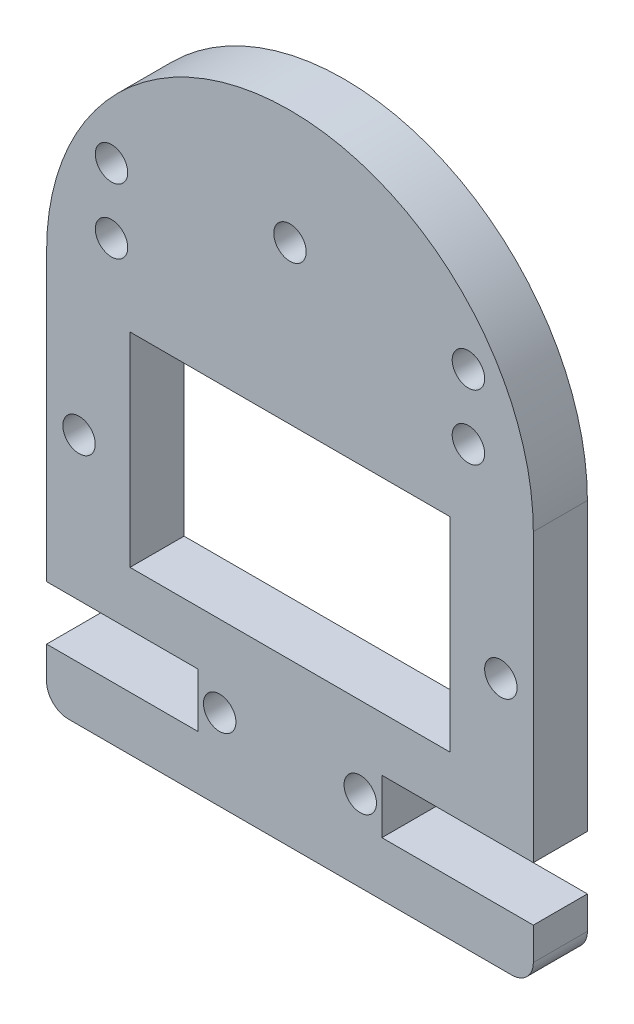
ISO-10303-21;
HEADER;
FILE_DESCRIPTION(('STEP AP214'),'2;1');
FILE_NAME('part.step','',(''),(''),'','','');
FILE_SCHEMA(('AUTOMOTIVE_DESIGN { 1 0 10303 214 1 1 1 1 }'));
ENDSEC;
DATA;
#1=APPLICATION_CONTEXT('core data for automotive mechanical design processes');
#2=APPLICATION_PROTOCOL_DEFINITION('international standard','automotive_design',2000,#1);
#3=PRODUCT_CONTEXT('',#1,'mechanical');
#4=PRODUCT('Part','Part','',(#3));
#5=PRODUCT_RELATED_PRODUCT_CATEGORY('part','',(#4));
#6=PRODUCT_DEFINITION_FORMATION('','',#4);
#7=PRODUCT_DEFINITION_CONTEXT('part definition',#1,'design');
#8=PRODUCT_DEFINITION('design','',#6,#7);
#9=PRODUCT_DEFINITION_SHAPE('','',#8);
#10=(LENGTH_UNIT() NAMED_UNIT(*) SI_UNIT(.MILLI.,.METRE.));
#11=(NAMED_UNIT(*) PLANE_ANGLE_UNIT() SI_UNIT($,.RADIAN.));
#12=(NAMED_UNIT(*) SI_UNIT($,.STERADIAN.) SOLID_ANGLE_UNIT());
#13=UNCERTAINTY_MEASURE_WITH_UNIT(LENGTH_MEASURE(1.E-05),#10,'distance_accuracy_value','');
#14=(GEOMETRIC_REPRESENTATION_CONTEXT(3) GLOBAL_UNCERTAINTY_ASSIGNED_CONTEXT((#13)) GLOBAL_UNIT_ASSIGNED_CONTEXT((#10,
#11,#12)) REPRESENTATION_CONTEXT('',''));
#15=CARTESIAN_POINT('',(0.,0.,0.));
#16=DIRECTION('',(0.,0.,1.));
#17=DIRECTION('',(1.,0.,0.));
#18=AXIS2_PLACEMENT_3D('',#15,#16,#17);
#19=CARTESIAN_POINT('',(-1.76634170575383,13.25,5.));
#20=DIRECTION('',(0.,0.,-1.));
#21=DIRECTION('',(-1.,0.,0.));
#22=AXIS2_PLACEMENT_3D('',#19,#20,#21);
#23=CYLINDRICAL_SURFACE('',#22,22.5);
#24=CARTESIAN_POINT('',(-1.76634170575383,13.25,0.));
#25=DIRECTION('',(0.,0.,1.));
#26=DIRECTION('',(1.,0.,0.));
#27=AXIS2_PLACEMENT_3D('',#24,#25,#26);
#28=CIRCLE('',#27,22.5);
#29=CARTESIAN_POINT('',(20.7336582942462,13.25,0.));
#30=VERTEX_POINT('',#29);
#31=CARTESIAN_POINT('',(-24.2663417057538,13.25,0.));
#32=VERTEX_POINT('',#31);
#33=EDGE_CURVE('E196',#30,#32,#28,.T.);
#34=ORIENTED_EDGE('',*,*,#33,.T.);
#35=DIRECTION('',(0.,0.,-1.));
#36=VECTOR('',#35,1.);
#37=CARTESIAN_POINT('',(-24.2663417057538,13.25,5.));
#38=LINE('',#37,#36);
#39=CARTESIAN_POINT('',(-24.2663417057538,13.25,5.));
#40=VERTEX_POINT('',#39);
#41=EDGE_CURVE('E11',#40,#32,#38,.T.);
#42=ORIENTED_EDGE('',*,*,#41,.F.);
#43=CARTESIAN_POINT('',(-1.76634170575383,13.25,5.));
#44=DIRECTION('',(0.,0.,1.));
#45=DIRECTION('',(1.,0.,0.));
#46=AXIS2_PLACEMENT_3D('',#43,#44,#45);
#47=CIRCLE('',#46,22.5);
#48=CARTESIAN_POINT('',(20.7336582942462,13.25,5.));
#49=VERTEX_POINT('',#48);
#50=EDGE_CURVE('E200',#49,#40,#47,.T.);
#51=ORIENTED_EDGE('',*,*,#50,.F.);
#52=DIRECTION('',(0.,0.,-1.));
#53=VECTOR('',#52,1.);
#54=CARTESIAN_POINT('',(20.7336582942462,13.25,5.));
#55=LINE('',#54,#53);
#56=EDGE_CURVE('E230',#49,#30,#55,.T.);
#57=ORIENTED_EDGE('',*,*,#56,.T.);
#58=EDGE_LOOP('',(#34,#42,#51,#57));
#59=FACE_BOUND('',#58,.T.);
#60=ADVANCED_FACE('F33',(#59),#23,.T.);
#61=CARTESIAN_POINT('',(-24.2663417057538,-13.25,5.));
#62=DIRECTION('',(1.,0.,0.));
#63=DIRECTION('',(0.,0.,-1.));
#64=AXIS2_PLACEMENT_3D('',#61,#62,#63);
#65=PLANE('',#64);
#66=DIRECTION('',(0.,-1.,0.));
#67=VECTOR('',#66,1.);
#68=CARTESIAN_POINT('',(-24.2663417057538,-13.25,0.));
#69=LINE('',#68,#67);
#70=CARTESIAN_POINT('',(-24.2663417057538,-13.25,0.));
#71=VERTEX_POINT('',#70);
#72=EDGE_CURVE('E233',#32,#71,#69,.T.);
#73=ORIENTED_EDGE('',*,*,#72,.T.);
#74=DIRECTION('',(0.,0.,-1.));
#75=VECTOR('',#74,1.);
#76=CARTESIAN_POINT('',(-24.2663417057538,-13.25,5.));
#77=LINE('',#76,#75);
#78=CARTESIAN_POINT('',(-24.2663417057538,-13.25,5.));
#79=VERTEX_POINT('',#78);
#80=EDGE_CURVE('E41',#79,#71,#77,.T.);
#81=ORIENTED_EDGE('',*,*,#80,.F.);
#82=DIRECTION('',(0.,-1.,0.));
#83=VECTOR('',#82,1.);
#84=CARTESIAN_POINT('',(-24.2663417057538,-3.25,5.));
#85=LINE('',#84,#83);
#86=EDGE_CURVE('E203',#40,#79,#85,.T.);
#87=ORIENTED_EDGE('',*,*,#86,.F.);
#88=ORIENTED_EDGE('',*,*,#41,.T.);
#89=EDGE_LOOP('',(#73,#81,#87,#88));
#90=FACE_BOUND('',#89,.T.);
#91=ADVANCED_FACE('F420',(#90),#65,.F.);
#92=CARTESIAN_POINT('',(-10.2663417057538,-13.25,5.));
#93=DIRECTION('',(0.,1.,0.));
#94=DIRECTION('',(0.,0.,1.));
#95=AXIS2_PLACEMENT_3D('',#92,#93,#94);
#96=PLANE('',#95);
#97=DIRECTION('',(1.,0.,0.));
#98=VECTOR('',#97,1.);
#99=CARTESIAN_POINT('',(-10.2663417057538,-13.25,0.));
#100=LINE('',#99,#98);
#101=CARTESIAN_POINT('',(-10.2663417057538,-13.25,0.));
#102=VERTEX_POINT('',#101);
#103=EDGE_CURVE('E235',#71,#102,#100,.T.);
#104=ORIENTED_EDGE('',*,*,#103,.T.);
#105=DIRECTION('',(0.,0.,-1.));
#106=VECTOR('',#105,1.);
#107=CARTESIAN_POINT('',(-10.2663417057538,-13.25,5.));
#108=LINE('',#107,#106);
#109=CARTESIAN_POINT('',(-10.2663417057538,-13.25,5.));
#110=VERTEX_POINT('',#109);
#111=EDGE_CURVE('E291',#110,#102,#108,.T.);
#112=ORIENTED_EDGE('',*,*,#111,.F.);
#113=DIRECTION('',(1.,0.,0.));
#114=VECTOR('',#113,1.);
#115=CARTESIAN_POINT('',(-10.2663417057538,-13.25,5.));
#116=LINE('',#115,#114);
#117=EDGE_CURVE('E206',#79,#110,#116,.T.);
#118=ORIENTED_EDGE('',*,*,#117,.F.);
#119=ORIENTED_EDGE('',*,*,#80,.T.);
#120=EDGE_LOOP('',(#104,#112,#118,#119));
#121=FACE_BOUND('',#120,.T.);
#122=ADVANCED_FACE('F416',(#121),#96,.F.);
#123=CARTESIAN_POINT('',(-10.2663417057538,-13.25,5.));
#124=DIRECTION('',(1.,0.,0.));
#125=DIRECTION('',(0.,1.,0.));
#126=AXIS2_PLACEMENT_3D('',#123,#124,#125);
#127=PLANE('',#126);
#128=DIRECTION('',(0.,-1.,0.));
#129=VECTOR('',#128,1.);
#130=CARTESIAN_POINT('',(-10.2663417057538,-13.25,0.));
#131=LINE('',#130,#129);
#132=CARTESIAN_POINT('',(-10.2663417057538,-18.25,0.));
#133=VERTEX_POINT('',#132);
#134=EDGE_CURVE('E237',#102,#133,#131,.T.);
#135=ORIENTED_EDGE('',*,*,#134,.T.);
#136=DIRECTION('',(0.,0.,-1.));
#137=VECTOR('',#136,1.);
#138=CARTESIAN_POINT('',(-10.2663417057538,-18.25,5.));
#139=LINE('',#138,#137);
#140=CARTESIAN_POINT('',(-10.2663417057538,-18.25,5.));
#141=VERTEX_POINT('',#140);
#142=EDGE_CURVE('E288',#141,#133,#139,.T.);
#143=ORIENTED_EDGE('',*,*,#142,.F.);
#144=DIRECTION('',(0.,-1.,0.));
#145=VECTOR('',#144,1.);
#146=CARTESIAN_POINT('',(-10.2663417057538,-13.25,5.));
#147=LINE('',#146,#145);
#148=EDGE_CURVE('E208',#110,#141,#147,.T.);
#149=ORIENTED_EDGE('',*,*,#148,.F.);
#150=ORIENTED_EDGE('',*,*,#111,.T.);
#151=EDGE_LOOP('',(#135,#143,#149,#150));
#152=FACE_BOUND('',#151,.T.);
#153=ADVANCED_FACE('F413',(#152),#127,.F.);
#154=CARTESIAN_POINT('',(-10.2663417057538,-18.25,5.));
#155=DIRECTION('',(0.,-1.,0.));
#156=DIRECTION('',(0.,0.,-1.));
#157=AXIS2_PLACEMENT_3D('',#154,#155,#156);
#158=PLANE('',#157);
#159=DIRECTION('',(-1.,0.,0.));
#160=VECTOR('',#159,1.);
#161=CARTESIAN_POINT('',(-10.2663417057538,-18.25,0.));
#162=LINE('',#161,#160);
#163=CARTESIAN_POINT('',(-24.2663417057538,-18.25,0.));
#164=VERTEX_POINT('',#163);
#165=EDGE_CURVE('E239',#133,#164,#162,.T.);
#166=ORIENTED_EDGE('',*,*,#165,.T.);
#167=DIRECTION('',(0.,0.,-1.));
#168=VECTOR('',#167,1.);
#169=CARTESIAN_POINT('',(-24.2663417057538,-18.25,5.));
#170=LINE('',#169,#168);
#171=CARTESIAN_POINT('',(-24.2663417057538,-18.25,5.));
#172=VERTEX_POINT('',#171);
#173=EDGE_CURVE('E285',#172,#164,#170,.T.);
#174=ORIENTED_EDGE('',*,*,#173,.F.);
#175=DIRECTION('',(-1.,0.,0.));
#176=VECTOR('',#175,1.);
#177=CARTESIAN_POINT('',(-10.2663417057538,-18.25,5.));
#178=LINE('',#177,#176);
#179=EDGE_CURVE('E210',#141,#172,#178,.T.);
#180=ORIENTED_EDGE('',*,*,#179,.F.);
#181=ORIENTED_EDGE('',*,*,#142,.T.);
#182=EDGE_LOOP('',(#166,#174,#180,#181));
#183=FACE_BOUND('',#182,.T.);
#184=ADVANCED_FACE('F409',(#183),#158,.F.);
#185=CARTESIAN_POINT('',(-24.2663417057538,-18.25,5.));
#186=DIRECTION('',(1.,0.,0.));
#187=DIRECTION('',(0.,0.,-1.));
#188=AXIS2_PLACEMENT_3D('',#185,#186,#187);
#189=PLANE('',#188);
#190=DIRECTION('',(0.,-1.,0.));
#191=VECTOR('',#190,1.);
#192=CARTESIAN_POINT('',(-24.2663417057538,-18.25,0.));
#193=LINE('',#192,#191);
#194=CARTESIAN_POINT('',(-24.2663417057538,-21.25,0.));
#195=VERTEX_POINT('',#194);
#196=EDGE_CURVE('E241',#164,#195,#193,.T.);
#197=ORIENTED_EDGE('',*,*,#196,.T.);
#198=DIRECTION('',(0.,0.,-1.));
#199=VECTOR('',#198,1.);
#200=CARTESIAN_POINT('',(-24.2663417057538,-21.25,5.));
#201=LINE('',#200,#199);
#202=CARTESIAN_POINT('',(-24.2663417057538,-21.25,5.));
#203=VERTEX_POINT('',#202);
#204=EDGE_CURVE('E282',#203,#195,#201,.T.);
#205=ORIENTED_EDGE('',*,*,#204,.F.);
#206=DIRECTION('',(0.,-1.,0.));
#207=VECTOR('',#206,1.);
#208=CARTESIAN_POINT('',(-24.2663417057538,-18.25,5.));
#209=LINE('',#208,#207);
#210=EDGE_CURVE('E212',#172,#203,#209,.T.);
#211=ORIENTED_EDGE('',*,*,#210,.F.);
#212=ORIENTED_EDGE('',*,*,#173,.T.);
#213=EDGE_LOOP('',(#197,#205,#211,#212));
#214=FACE_BOUND('',#213,.T.);
#215=ADVANCED_FACE('F404',(#214),#189,.F.);
#216=CARTESIAN_POINT('',(-22.2663417057538,-21.25,5.));
#217=DIRECTION('',(0.,0.,-1.));
#218=DIRECTION('',(-1.,0.,0.));
#219=AXIS2_PLACEMENT_3D('',#216,#217,#218);
#220=CYLINDRICAL_SURFACE('',#219,2.);
#221=CARTESIAN_POINT('',(-22.2663417057538,-21.25,0.));
#222=DIRECTION('',(0.,0.,1.));
#223=DIRECTION('',(1.,0.,0.));
#224=AXIS2_PLACEMENT_3D('',#221,#222,#223);
#225=CIRCLE('',#224,2.);
#226=CARTESIAN_POINT('',(-22.2663417057538,-23.25,0.));
#227=VERTEX_POINT('',#226);
#228=EDGE_CURVE('E243',#195,#227,#225,.T.);
#229=ORIENTED_EDGE('',*,*,#228,.T.);
#230=DIRECTION('',(0.,0.,-1.));
#231=VECTOR('',#230,1.);
#232=CARTESIAN_POINT('',(-22.2663417057538,-23.25,5.));
#233=LINE('',#232,#231);
#234=CARTESIAN_POINT('',(-22.2663417057538,-23.25,5.));
#235=VERTEX_POINT('',#234);
#236=EDGE_CURVE('E279',#235,#227,#233,.T.);
#237=ORIENTED_EDGE('',*,*,#236,.F.);
#238=CARTESIAN_POINT('',(-22.2663417057538,-21.25,5.));
#239=DIRECTION('',(0.,0.,1.));
#240=DIRECTION('',(1.,0.,0.));
#241=AXIS2_PLACEMENT_3D('',#238,#239,#240);
#242=CIRCLE('',#241,2.);
#243=EDGE_CURVE('E214',#203,#235,#242,.T.);
#244=ORIENTED_EDGE('',*,*,#243,.F.);
#245=ORIENTED_EDGE('',*,*,#204,.T.);
#246=EDGE_LOOP('',(#229,#237,#244,#245));
#247=FACE_BOUND('',#246,.T.);
#248=ADVANCED_FACE('F398',(#247),#220,.T.);
#249=CARTESIAN_POINT('',(18.7336582942462,-23.25,5.));
#250=DIRECTION('',(0.,1.,0.));
#251=DIRECTION('',(0.,0.,1.));
#252=AXIS2_PLACEMENT_3D('',#249,#250,#251);
#253=PLANE('',#252);
#254=DIRECTION('',(1.,0.,0.));
#255=VECTOR('',#254,1.);
#256=CARTESIAN_POINT('',(18.7336582942462,-23.25,0.));
#257=LINE('',#256,#255);
#258=CARTESIAN_POINT('',(18.7336582942462,-23.25,0.));
#259=VERTEX_POINT('',#258);
#260=EDGE_CURVE('E245',#227,#259,#257,.T.);
#261=ORIENTED_EDGE('',*,*,#260,.T.);
#262=DIRECTION('',(0.,0.,-1.));
#263=VECTOR('',#262,1.);
#264=CARTESIAN_POINT('',(18.7336582942462,-23.25,5.));
#265=LINE('',#264,#263);
#266=CARTESIAN_POINT('',(18.7336582942462,-23.25,5.));
#267=VERTEX_POINT('',#266);
#268=EDGE_CURVE('E276',#267,#259,#265,.T.);
#269=ORIENTED_EDGE('',*,*,#268,.F.);
#270=DIRECTION('',(1.,0.,0.));
#271=VECTOR('',#270,1.);
#272=CARTESIAN_POINT('',(18.7336582942462,-23.25,5.));
#273=LINE('',#272,#271);
#274=EDGE_CURVE('E216',#235,#267,#273,.T.);
#275=ORIENTED_EDGE('',*,*,#274,.F.);
#276=ORIENTED_EDGE('',*,*,#236,.T.);
#277=EDGE_LOOP('',(#261,#269,#275,#276));
#278=FACE_BOUND('',#277,.T.);
#279=ADVANCED_FACE('F394',(#278),#253,.F.);
#280=CARTESIAN_POINT('',(18.7336582942462,-21.25,5.));
#281=DIRECTION('',(0.,0.,-1.));
#282=DIRECTION('',(-1.,0.,0.));
#283=AXIS2_PLACEMENT_3D('',#280,#281,#282);
#284=CYLINDRICAL_SURFACE('',#283,2.);
#285=CARTESIAN_POINT('',(18.7336582942462,-21.25,0.));
#286=DIRECTION('',(0.,0.,1.));
#287=DIRECTION('',(1.,0.,0.));
#288=AXIS2_PLACEMENT_3D('',#285,#286,#287);
#289=CIRCLE('',#288,2.);
#290=CARTESIAN_POINT('',(20.7336582942462,-21.25,0.));
#291=VERTEX_POINT('',#290);
#292=EDGE_CURVE('E247',#259,#291,#289,.T.);
#293=ORIENTED_EDGE('',*,*,#292,.T.);
#294=DIRECTION('',(0.,0.,-1.));
#295=VECTOR('',#294,1.);
#296=CARTESIAN_POINT('',(20.7336582942462,-21.25,5.));
#297=LINE('',#296,#295);
#298=CARTESIAN_POINT('',(20.7336582942462,-21.25,5.));
#299=VERTEX_POINT('',#298);
#300=EDGE_CURVE('E273',#299,#291,#297,.T.);
#301=ORIENTED_EDGE('',*,*,#300,.F.);
#302=CARTESIAN_POINT('',(18.7336582942462,-21.25,5.));
#303=DIRECTION('',(0.,0.,1.));
#304=DIRECTION('',(1.,0.,0.));
#305=AXIS2_PLACEMENT_3D('',#302,#303,#304);
#306=CIRCLE('',#305,2.);
#307=EDGE_CURVE('E218',#267,#299,#306,.T.);
#308=ORIENTED_EDGE('',*,*,#307,.F.);
#309=ORIENTED_EDGE('',*,*,#268,.T.);
#310=EDGE_LOOP('',(#293,#301,#308,#309));
#311=FACE_BOUND('',#310,.T.);
#312=ADVANCED_FACE('F389',(#311),#284,.T.);
#313=CARTESIAN_POINT('',(20.7336582942462,-18.25,5.));
#314=DIRECTION('',(-1.,0.,0.));
#315=DIRECTION('',(0.,0.,1.));
#316=AXIS2_PLACEMENT_3D('',#313,#314,#315);
#317=PLANE('',#316);
#318=DIRECTION('',(0.,1.,0.));
#319=VECTOR('',#318,1.);
#320=CARTESIAN_POINT('',(20.7336582942462,-18.25,0.));
#321=LINE('',#320,#319);
#322=CARTESIAN_POINT('',(20.7336582942462,-18.25,0.));
#323=VERTEX_POINT('',#322);
#324=EDGE_CURVE('E249',#291,#323,#321,.T.);
#325=ORIENTED_EDGE('',*,*,#324,.T.);
#326=DIRECTION('',(0.,0.,-1.));
#327=VECTOR('',#326,1.);
#328=CARTESIAN_POINT('',(20.7336582942462,-18.25,5.));
#329=LINE('',#328,#327);
#330=CARTESIAN_POINT('',(20.7336582942462,-18.25,5.));
#331=VERTEX_POINT('',#330);
#332=EDGE_CURVE('E270',#331,#323,#329,.T.);
#333=ORIENTED_EDGE('',*,*,#332,.F.);
#334=DIRECTION('',(0.,1.,0.));
#335=VECTOR('',#334,1.);
#336=CARTESIAN_POINT('',(20.7336582942462,-18.25,5.));
#337=LINE('',#336,#335);
#338=EDGE_CURVE('E220',#299,#331,#337,.T.);
#339=ORIENTED_EDGE('',*,*,#338,.F.);
#340=ORIENTED_EDGE('',*,*,#300,.T.);
#341=EDGE_LOOP('',(#325,#333,#339,#340));
#342=FACE_BOUND('',#341,.T.);
#343=ADVANCED_FACE('F383',(#342),#317,.F.);
#344=CARTESIAN_POINT('',(6.73365829424617,-18.25,5.));
#345=DIRECTION('',(0.,-1.,0.));
#346=DIRECTION('',(0.,0.,-1.));
#347=AXIS2_PLACEMENT_3D('',#344,#345,#346);
#348=PLANE('',#347);
#349=DIRECTION('',(-1.,0.,0.));
#350=VECTOR('',#349,1.);
#351=CARTESIAN_POINT('',(6.73365829424617,-18.25,0.));
#352=LINE('',#351,#350);
#353=CARTESIAN_POINT('',(6.73365829424617,-18.25,0.));
#354=VERTEX_POINT('',#353);
#355=EDGE_CURVE('E251',#323,#354,#352,.T.);
#356=ORIENTED_EDGE('',*,*,#355,.T.);
#357=DIRECTION('',(0.,0.,-1.));
#358=VECTOR('',#357,1.);
#359=CARTESIAN_POINT('',(6.73365829424617,-18.25,5.));
#360=LINE('',#359,#358);
#361=CARTESIAN_POINT('',(6.73365829424617,-18.25,5.));
#362=VERTEX_POINT('',#361);
#363=EDGE_CURVE('E267',#362,#354,#360,.T.);
#364=ORIENTED_EDGE('',*,*,#363,.F.);
#365=DIRECTION('',(-1.,0.,0.));
#366=VECTOR('',#365,1.);
#367=CARTESIAN_POINT('',(6.73365829424617,-18.25,5.));
#368=LINE('',#367,#366);
#369=EDGE_CURVE('E222',#331,#362,#368,.T.);
#370=ORIENTED_EDGE('',*,*,#369,.F.);
#371=ORIENTED_EDGE('',*,*,#332,.T.);
#372=EDGE_LOOP('',(#356,#364,#370,#371));
#373=FACE_BOUND('',#372,.T.);
#374=ADVANCED_FACE('F379',(#373),#348,.F.);
#375=CARTESIAN_POINT('',(6.73365829424617,-13.25,5.));
#376=DIRECTION('',(-1.,0.,0.));
#377=DIRECTION('',(0.,0.,1.));
#378=AXIS2_PLACEMENT_3D('',#375,#376,#377);
#379=PLANE('',#378);
#380=DIRECTION('',(0.,1.,0.));
#381=VECTOR('',#380,1.);
#382=CARTESIAN_POINT('',(6.73365829424617,-13.25,0.));
#383=LINE('',#382,#381);
#384=CARTESIAN_POINT('',(6.73365829424617,-13.25,0.));
#385=VERTEX_POINT('',#384);
#386=EDGE_CURVE('E253',#354,#385,#383,.T.);
#387=ORIENTED_EDGE('',*,*,#386,.T.);
#388=DIRECTION('',(0.,0.,-1.));
#389=VECTOR('',#388,1.);
#390=CARTESIAN_POINT('',(6.73365829424617,-13.25,5.));
#391=LINE('',#390,#389);
#392=CARTESIAN_POINT('',(6.73365829424617,-13.25,5.));
#393=VERTEX_POINT('',#392);
#394=EDGE_CURVE('E264',#393,#385,#391,.T.);
#395=ORIENTED_EDGE('',*,*,#394,.F.);
#396=DIRECTION('',(0.,1.,0.));
#397=VECTOR('',#396,1.);
#398=CARTESIAN_POINT('',(6.73365829424617,-13.25,5.));
#399=LINE('',#398,#397);
#400=EDGE_CURVE('E224',#362,#393,#399,.T.);
#401=ORIENTED_EDGE('',*,*,#400,.F.);
#402=ORIENTED_EDGE('',*,*,#363,.T.);
#403=EDGE_LOOP('',(#387,#395,#401,#402));
#404=FACE_BOUND('',#403,.T.);
#405=ADVANCED_FACE('F374',(#404),#379,.F.);
#406=CARTESIAN_POINT('',(6.73365829424617,-13.25,5.));
#407=DIRECTION('',(0.,1.,0.));
#408=DIRECTION('',(0.,0.,1.));
#409=AXIS2_PLACEMENT_3D('',#406,#407,#408);
#410=PLANE('',#409);
#411=DIRECTION('',(1.,0.,0.));
#412=VECTOR('',#411,1.);
#413=CARTESIAN_POINT('',(6.73365829424617,-13.25,0.));
#414=LINE('',#413,#412);
#415=CARTESIAN_POINT('',(20.7336582942462,-13.25,0.));
#416=VERTEX_POINT('',#415);
#417=EDGE_CURVE('E255',#385,#416,#414,.T.);
#418=ORIENTED_EDGE('',*,*,#417,.T.);
#419=DIRECTION('',(0.,0.,-1.));
#420=VECTOR('',#419,1.);
#421=CARTESIAN_POINT('',(20.7336582942462,-13.25,5.));
#422=LINE('',#421,#420);
#423=CARTESIAN_POINT('',(20.7336582942462,-13.25,5.));
#424=VERTEX_POINT('',#423);
#425=EDGE_CURVE('E261',#424,#416,#422,.T.);
#426=ORIENTED_EDGE('',*,*,#425,.F.);
#427=DIRECTION('',(1.,0.,0.));
#428=VECTOR('',#427,1.);
#429=CARTESIAN_POINT('',(6.73365829424617,-13.25,5.));
#430=LINE('',#429,#428);
#431=EDGE_CURVE('E226',#393,#424,#430,.T.);
#432=ORIENTED_EDGE('',*,*,#431,.F.);
#433=ORIENTED_EDGE('',*,*,#394,.T.);
#434=EDGE_LOOP('',(#418,#426,#432,#433));
#435=FACE_BOUND('',#434,.T.);
#436=ADVANCED_FACE('F368',(#435),#410,.F.);
#437=CARTESIAN_POINT('',(20.7336582942462,-3.22226862184038,5.));
#438=DIRECTION('',(-1.,0.,0.));
#439=DIRECTION('',(0.,0.,1.));
#440=AXIS2_PLACEMENT_3D('',#437,#438,#439);
#441=PLANE('',#440);
#442=DIRECTION('',(0.,1.,0.));
#443=VECTOR('',#442,1.);
#444=CARTESIAN_POINT('',(20.7336582942462,-3.22226862184038,0.));
#445=LINE('',#444,#443);
#446=EDGE_CURVE('E204',#416,#30,#445,.T.);
#447=ORIENTED_EDGE('',*,*,#446,.T.);
#448=ORIENTED_EDGE('',*,*,#56,.F.);
#449=DIRECTION('',(0.,1.,0.));
#450=VECTOR('',#449,1.);
#451=CARTESIAN_POINT('',(20.7336582942462,-13.25,5.));
#452=LINE('',#451,#450);
#453=EDGE_CURVE('E228',#424,#49,#452,.T.);
#454=ORIENTED_EDGE('',*,*,#453,.F.);
#455=ORIENTED_EDGE('',*,*,#425,.T.);
#456=EDGE_LOOP('',(#447,#448,#454,#455));
#457=FACE_BOUND('',#456,.T.);
#458=ADVANCED_FACE('F364',(#457),#441,.F.);
#459=CARTESIAN_POINT('',(-1.76634170575383,13.25,5.));
#460=DIRECTION('',(0.,0.,1.));
#461=DIRECTION('',(1.,0.,0.));
#462=AXIS2_PLACEMENT_3D('',#459,#460,#461);
#463=PLANE('',#462);
#464=CARTESIAN_POINT('',(14.7336582942462,23.25,5.));
#465=DIRECTION('',(0.,0.,1.));
#466=DIRECTION('',(1.,0.,0.));
#467=AXIS2_PLACEMENT_3D('',#464,#465,#466);
#468=CIRCLE('',#467,1.5);
#469=CARTESIAN_POINT('',(16.2336582942462,23.25,5.));
#470=VERTEX_POINT('',#469);
#471=EDGE_CURVE('E316',#470,#470,#468,.T.);
#472=ORIENTED_EDGE('',*,*,#471,.F.);
#473=EDGE_LOOP('',(#472));
#474=FACE_BOUND('',#473,.T.);
#475=CARTESIAN_POINT('',(-18.2663417057538,23.25,5.));
#476=DIRECTION('',(0.,0.,1.));
#477=DIRECTION('',(1.,0.,0.));
#478=AXIS2_PLACEMENT_3D('',#475,#476,#477);
#479=CIRCLE('',#478,1.5);
#480=CARTESIAN_POINT('',(-16.7663417057538,23.25,5.));
#481=VERTEX_POINT('',#480);
#482=EDGE_CURVE('E606',#481,#481,#479,.T.);
#483=ORIENTED_EDGE('',*,*,#482,.F.);
#484=EDGE_LOOP('',(#483));
#485=FACE_BOUND('',#484,.T.);
#486=CARTESIAN_POINT('',(-18.2663417057538,17.25,5.));
#487=DIRECTION('',(0.,0.,1.));
#488=DIRECTION('',(1.,0.,0.));
#489=AXIS2_PLACEMENT_3D('',#486,#487,#488);
#490=CIRCLE('',#489,1.5);
#491=CARTESIAN_POINT('',(-16.7663417057538,17.25,5.));
#492=VERTEX_POINT('',#491);
#493=EDGE_CURVE('E329',#492,#492,#490,.T.);
#494=ORIENTED_EDGE('',*,*,#493,.F.);
#495=EDGE_LOOP('',(#494));
#496=FACE_BOUND('',#495,.T.);
#497=CARTESIAN_POINT('',(14.7336582942462,17.25,5.));
#498=DIRECTION('',(0.,0.,1.));
#499=DIRECTION('',(1.,0.,0.));
#500=AXIS2_PLACEMENT_3D('',#497,#498,#499);
#501=CIRCLE('',#500,1.5);
#502=CARTESIAN_POINT('',(16.2336582942462,17.25,5.));
#503=VERTEX_POINT('',#502);
#504=EDGE_CURVE('E312',#503,#503,#501,.T.);
#505=ORIENTED_EDGE('',*,*,#504,.F.);
#506=EDGE_LOOP('',(#505));
#507=FACE_BOUND('',#506,.T.);
#508=CARTESIAN_POINT('',(-1.76634170575383,25.15,5.));
#509=DIRECTION('',(0.,0.,1.));
#510=DIRECTION('',(1.,0.,0.));
#511=AXIS2_PLACEMENT_3D('',#508,#509,#510);
#512=CIRCLE('',#511,1.5);
#513=CARTESIAN_POINT('',(-0.266341705753831,25.15,5.));
#514=VERTEX_POINT('',#513);
#515=EDGE_CURVE('E308',#514,#514,#512,.T.);
#516=ORIENTED_EDGE('',*,*,#515,.F.);
#517=EDGE_LOOP('',(#516));
#518=FACE_BOUND('',#517,.T.);
#519=CARTESIAN_POINT('',(-8.26634170575383,-15.75,5.));
#520=DIRECTION('',(0.,0.,1.));
#521=DIRECTION('',(1.,0.,0.));
#522=AXIS2_PLACEMENT_3D('',#519,#520,#521);
#523=CIRCLE('',#522,1.5);
#524=CARTESIAN_POINT('',(-6.76634170575383,-15.75,5.));
#525=VERTEX_POINT('',#524);
#526=EDGE_CURVE('E304',#525,#525,#523,.T.);
#527=ORIENTED_EDGE('',*,*,#526,.F.);
#528=EDGE_LOOP('',(#527));
#529=FACE_BOUND('',#528,.T.);
#530=CARTESIAN_POINT('',(4.73365829424617,-15.75,5.));
#531=DIRECTION('',(0.,0.,1.));
#532=DIRECTION('',(1.,0.,0.));
#533=AXIS2_PLACEMENT_3D('',#530,#531,#532);
#534=CIRCLE('',#533,1.5);
#535=CARTESIAN_POINT('',(6.23365829424617,-15.75,5.));
#536=VERTEX_POINT('',#535);
#537=EDGE_CURVE('E300',#536,#536,#534,.T.);
#538=ORIENTED_EDGE('',*,*,#537,.F.);
#539=EDGE_LOOP('',(#538));
#540=FACE_BOUND('',#539,.T.);
#541=CARTESIAN_POINT('',(-21.2663417057538,0.,5.));
#542=DIRECTION('',(0.,0.,-1.));
#543=DIRECTION('',(-1.,0.,0.));
#544=AXIS2_PLACEMENT_3D('',#541,#542,#543);
#545=CIRCLE('',#544,1.5);
#546=CARTESIAN_POINT('',(-22.7663417057538,0.,5.));
#547=VERTEX_POINT('',#546);
#548=EDGE_CURVE('E337',#547,#547,#545,.T.);
#549=ORIENTED_EDGE('',*,*,#548,.T.);
#550=EDGE_LOOP('',(#549));
#551=FACE_BOUND('',#550,.T.);
#552=CARTESIAN_POINT('',(17.7336582942462,0.,5.));
#553=DIRECTION('',(0.,0.,-1.));
#554=DIRECTION('',(-1.,0.,0.));
#555=AXIS2_PLACEMENT_3D('',#552,#553,#554);
#556=CIRCLE('',#555,1.5);
#557=CARTESIAN_POINT('',(16.2336582942462,0.,5.));
#558=VERTEX_POINT('',#557);
#559=EDGE_CURVE('E190',#558,#558,#556,.T.);
#560=ORIENTED_EDGE('',*,*,#559,.T.);
#561=EDGE_LOOP('',(#560));
#562=FACE_BOUND('',#561,.T.);
#563=DIRECTION('',(0.,1.,0.));
#564=VECTOR('',#563,1.);
#565=CARTESIAN_POINT('',(-16.5563417057538,-8.25,5.));
#566=LINE('',#565,#564);
#567=CARTESIAN_POINT('',(-16.5563417057538,-8.25,5.));
#568=VERTEX_POINT('',#567);
#569=CARTESIAN_POINT('',(-16.5563417057538,10.6,5.));
#570=VERTEX_POINT('',#569);
#571=EDGE_CURVE('E161',#568,#570,#566,.T.);
#572=ORIENTED_EDGE('',*,*,#571,.T.);
#573=DIRECTION('',(1.,0.,0.));
#574=VECTOR('',#573,1.);
#575=CARTESIAN_POINT('',(-16.5563417057538,10.6,5.));
#576=LINE('',#575,#574);
#577=CARTESIAN_POINT('',(13.0236582942462,10.6,5.));
#578=VERTEX_POINT('',#577);
#579=EDGE_CURVE('E170',#570,#578,#576,.T.);
#580=ORIENTED_EDGE('',*,*,#579,.T.);
#581=DIRECTION('',(0.,-1.,0.));
#582=VECTOR('',#581,1.);
#583=CARTESIAN_POINT('',(13.0236582942462,-8.25,5.));
#584=LINE('',#583,#582);
#585=CARTESIAN_POINT('',(13.0236582942462,-8.25,5.));
#586=VERTEX_POINT('',#585);
#587=EDGE_CURVE('E49',#578,#586,#584,.T.);
#588=ORIENTED_EDGE('',*,*,#587,.T.);
#589=DIRECTION('',(-1.,0.,0.));
#590=VECTOR('',#589,1.);
#591=CARTESIAN_POINT('',(-16.5563417057538,-8.25,5.));
#592=LINE('',#591,#590);
#593=EDGE_CURVE('E167',#586,#568,#592,.T.);
#594=ORIENTED_EDGE('',*,*,#593,.T.);
#595=EDGE_LOOP('',(#572,#580,#588,#594));
#596=FACE_BOUND('',#595,.T.);
#597=ORIENTED_EDGE('',*,*,#50,.T.);
#598=ORIENTED_EDGE('',*,*,#86,.T.);
#599=ORIENTED_EDGE('',*,*,#117,.T.);
#600=ORIENTED_EDGE('',*,*,#148,.T.);
#601=ORIENTED_EDGE('',*,*,#179,.T.);
#602=ORIENTED_EDGE('',*,*,#210,.T.);
#603=ORIENTED_EDGE('',*,*,#243,.T.);
#604=ORIENTED_EDGE('',*,*,#274,.T.);
#605=ORIENTED_EDGE('',*,*,#307,.T.);
#606=ORIENTED_EDGE('',*,*,#338,.T.);
#607=ORIENTED_EDGE('',*,*,#369,.T.);
#608=ORIENTED_EDGE('',*,*,#400,.T.);
#609=ORIENTED_EDGE('',*,*,#431,.T.);
#610=ORIENTED_EDGE('',*,*,#453,.T.);
#611=EDGE_LOOP('',(#597,#598,#599,#600,#601,#602,#603,#604,#605,#606,#607,#608,#609,#610));
#612=FACE_BOUND('',#611,.T.);
#613=ADVANCED_FACE('F174',(#474,#485,#496,#507,#518,#529,#540,#551,#562,#596,#612),#463,.T.);
#614=CARTESIAN_POINT('',(-1.76634170575383,13.25,0.));
#615=DIRECTION('',(0.,0.,1.));
#616=DIRECTION('',(1.,0.,0.));
#617=AXIS2_PLACEMENT_3D('',#614,#615,#616);
#618=PLANE('',#617);
#619=CARTESIAN_POINT('',(14.7336582942462,23.25,0.));
#620=DIRECTION('',(0.,0.,1.));
#621=DIRECTION('',(1.,0.,0.));
#622=AXIS2_PLACEMENT_3D('',#619,#620,#621);
#623=CIRCLE('',#622,1.5);
#624=CARTESIAN_POINT('',(16.2336582942462,23.25,0.));
#625=VERTEX_POINT('',#624);
#626=EDGE_CURVE('E36',#625,#625,#623,.T.);
#627=ORIENTED_EDGE('',*,*,#626,.T.);
#628=EDGE_LOOP('',(#627));
#629=FACE_BOUND('',#628,.T.);
#630=CARTESIAN_POINT('',(-18.2663417057538,23.25,0.));
#631=DIRECTION('',(0.,0.,1.));
#632=DIRECTION('',(1.,0.,0.));
#633=AXIS2_PLACEMENT_3D('',#630,#631,#632);
#634=CIRCLE('',#633,1.5);
#635=CARTESIAN_POINT('',(-16.7663417057538,23.25,0.));
#636=VERTEX_POINT('',#635);
#637=EDGE_CURVE('E315',#636,#636,#634,.T.);
#638=ORIENTED_EDGE('',*,*,#637,.T.);
#639=EDGE_LOOP('',(#638));
#640=FACE_BOUND('',#639,.T.);
#641=CARTESIAN_POINT('',(-18.2663417057538,17.25,0.));
#642=DIRECTION('',(0.,0.,1.));
#643=DIRECTION('',(1.,0.,0.));
#644=AXIS2_PLACEMENT_3D('',#641,#642,#643);
#645=CIRCLE('',#644,1.5);
#646=CARTESIAN_POINT('',(-16.7663417057538,17.25,0.));
#647=VERTEX_POINT('',#646);
#648=EDGE_CURVE('E313',#647,#647,#645,.T.);
#649=ORIENTED_EDGE('',*,*,#648,.T.);
#650=EDGE_LOOP('',(#649));
#651=FACE_BOUND('',#650,.T.);
#652=CARTESIAN_POINT('',(14.7336582942462,17.25,0.));
#653=DIRECTION('',(0.,0.,1.));
#654=DIRECTION('',(1.,0.,0.));
#655=AXIS2_PLACEMENT_3D('',#652,#653,#654);
#656=CIRCLE('',#655,1.5);
#657=CARTESIAN_POINT('',(16.2336582942462,17.25,0.));
#658=VERTEX_POINT('',#657);
#659=EDGE_CURVE('E309',#658,#658,#656,.T.);
#660=ORIENTED_EDGE('',*,*,#659,.T.);
#661=EDGE_LOOP('',(#660));
#662=FACE_BOUND('',#661,.T.);
#663=CARTESIAN_POINT('',(-1.76634170575383,25.15,0.));
#664=DIRECTION('',(0.,0.,1.));
#665=DIRECTION('',(1.,0.,0.));
#666=AXIS2_PLACEMENT_3D('',#663,#664,#665);
#667=CIRCLE('',#666,1.5);
#668=CARTESIAN_POINT('',(-0.266341705753831,25.15,0.));
#669=VERTEX_POINT('',#668);
#670=EDGE_CURVE('E305',#669,#669,#667,.T.);
#671=ORIENTED_EDGE('',*,*,#670,.T.);
#672=EDGE_LOOP('',(#671));
#673=FACE_BOUND('',#672,.T.);
#674=CARTESIAN_POINT('',(-8.26634170575383,-15.75,0.));
#675=DIRECTION('',(0.,0.,1.));
#676=DIRECTION('',(1.,0.,0.));
#677=AXIS2_PLACEMENT_3D('',#674,#675,#676);
#678=CIRCLE('',#677,1.5);
#679=CARTESIAN_POINT('',(-6.76634170575383,-15.75,0.));
#680=VERTEX_POINT('',#679);
#681=EDGE_CURVE('E301',#680,#680,#678,.T.);
#682=ORIENTED_EDGE('',*,*,#681,.T.);
#683=EDGE_LOOP('',(#682));
#684=FACE_BOUND('',#683,.T.);
#685=CARTESIAN_POINT('',(4.73365829424617,-15.75,0.));
#686=DIRECTION('',(0.,0.,1.));
#687=DIRECTION('',(1.,0.,0.));
#688=AXIS2_PLACEMENT_3D('',#685,#686,#687);
#689=CIRCLE('',#688,1.5);
#690=CARTESIAN_POINT('',(6.23365829424617,-15.75,0.));
#691=VERTEX_POINT('',#690);
#692=EDGE_CURVE('E296',#691,#691,#689,.T.);
#693=ORIENTED_EDGE('',*,*,#692,.T.);
#694=EDGE_LOOP('',(#693));
#695=FACE_BOUND('',#694,.T.);
#696=CARTESIAN_POINT('',(-21.2663417057538,0.,0.));
#697=DIRECTION('',(0.,0.,-1.));
#698=DIRECTION('',(-1.,0.,0.));
#699=AXIS2_PLACEMENT_3D('',#696,#697,#698);
#700=CIRCLE('',#699,1.5);
#701=CARTESIAN_POINT('',(-22.7663417057538,0.,0.));
#702=VERTEX_POINT('',#701);
#703=EDGE_CURVE('E299',#702,#702,#700,.T.);
#704=ORIENTED_EDGE('',*,*,#703,.F.);
#705=EDGE_LOOP('',(#704));
#706=FACE_BOUND('',#705,.T.);
#707=CARTESIAN_POINT('',(17.7336582942462,0.,0.));
#708=DIRECTION('',(0.,0.,-1.));
#709=DIRECTION('',(-1.,0.,0.));
#710=AXIS2_PLACEMENT_3D('',#707,#708,#709);
#711=CIRCLE('',#710,1.5);
#712=CARTESIAN_POINT('',(16.2336582942462,0.,0.));
#713=VERTEX_POINT('',#712);
#714=EDGE_CURVE('E183',#713,#713,#711,.T.);
#715=ORIENTED_EDGE('',*,*,#714,.F.);
#716=EDGE_LOOP('',(#715));
#717=FACE_BOUND('',#716,.T.);
#718=DIRECTION('',(1.,0.,0.));
#719=VECTOR('',#718,1.);
#720=CARTESIAN_POINT('',(-16.5563417057538,10.6,0.));
#721=LINE('',#720,#719);
#722=CARTESIAN_POINT('',(-16.5563417057538,10.6,0.));
#723=VERTEX_POINT('',#722);
#724=CARTESIAN_POINT('',(13.0236582942462,10.6,0.));
#725=VERTEX_POINT('',#724);
#726=EDGE_CURVE('E189',#723,#725,#721,.T.);
#727=ORIENTED_EDGE('',*,*,#726,.F.);
#728=DIRECTION('',(0.,1.,0.));
#729=VECTOR('',#728,1.);
#730=CARTESIAN_POINT('',(-16.5563417057538,-8.25,0.));
#731=LINE('',#730,#729);
#732=CARTESIAN_POINT('',(-16.5563417057538,-8.25,0.));
#733=VERTEX_POINT('',#732);
#734=EDGE_CURVE('E57',#733,#723,#731,.T.);
#735=ORIENTED_EDGE('',*,*,#734,.F.);
#736=DIRECTION('',(-1.,0.,0.));
#737=VECTOR('',#736,1.);
#738=CARTESIAN_POINT('',(-16.5563417057538,-8.25,0.));
#739=LINE('',#738,#737);
#740=CARTESIAN_POINT('',(13.0236582942462,-8.25,0.));
#741=VERTEX_POINT('',#740);
#742=EDGE_CURVE('E177',#741,#733,#739,.T.);
#743=ORIENTED_EDGE('',*,*,#742,.F.);
#744=DIRECTION('',(0.,-1.,0.));
#745=VECTOR('',#744,1.);
#746=CARTESIAN_POINT('',(13.0236582942462,-8.25,0.));
#747=LINE('',#746,#745);
#748=EDGE_CURVE('E180',#725,#741,#747,.T.);
#749=ORIENTED_EDGE('',*,*,#748,.F.);
#750=EDGE_LOOP('',(#727,#735,#743,#749));
#751=FACE_BOUND('',#750,.T.);
#752=ORIENTED_EDGE('',*,*,#33,.F.);
#753=ORIENTED_EDGE('',*,*,#446,.F.);
#754=ORIENTED_EDGE('',*,*,#417,.F.);
#755=ORIENTED_EDGE('',*,*,#386,.F.);
#756=ORIENTED_EDGE('',*,*,#355,.F.);
#757=ORIENTED_EDGE('',*,*,#324,.F.);
#758=ORIENTED_EDGE('',*,*,#292,.F.);
#759=ORIENTED_EDGE('',*,*,#260,.F.);
#760=ORIENTED_EDGE('',*,*,#228,.F.);
#761=ORIENTED_EDGE('',*,*,#196,.F.);
#762=ORIENTED_EDGE('',*,*,#165,.F.);
#763=ORIENTED_EDGE('',*,*,#134,.F.);
#764=ORIENTED_EDGE('',*,*,#103,.F.);
#765=ORIENTED_EDGE('',*,*,#72,.F.);
#766=EDGE_LOOP('',(#752,#753,#754,#755,#756,#757,#758,#759,#760,#761,#762,#763,#764,#765));
#767=FACE_BOUND('',#766,.T.);
#768=ADVANCED_FACE('F349',(#629,#640,#651,#662,#673,#684,#695,#706,#717,#751,#767),#618,.F.);
#769=CARTESIAN_POINT('',(-16.5563417057538,-8.25,5.));
#770=DIRECTION('',(-1.,0.,0.));
#771=DIRECTION('',(0.,0.,1.));
#772=AXIS2_PLACEMENT_3D('',#769,#770,#771);
#773=PLANE('',#772);
#774=ORIENTED_EDGE('',*,*,#734,.T.);
#775=DIRECTION('',(0.,0.,-1.));
#776=VECTOR('',#775,1.);
#777=CARTESIAN_POINT('',(-16.5563417057538,10.6,5.));
#778=LINE('',#777,#776);
#779=EDGE_CURVE('E157',#570,#723,#778,.T.);
#780=ORIENTED_EDGE('',*,*,#779,.F.);
#781=ORIENTED_EDGE('',*,*,#571,.F.);
#782=DIRECTION('',(0.,0.,-1.));
#783=VECTOR('',#782,1.);
#784=CARTESIAN_POINT('',(-16.5563417057538,-8.25,5.));
#785=LINE('',#784,#783);
#786=EDGE_CURVE('E194',#568,#733,#785,.T.);
#787=ORIENTED_EDGE('',*,*,#786,.T.);
#788=EDGE_LOOP('',(#774,#780,#781,#787));
#789=FACE_BOUND('',#788,.T.);
#790=ADVANCED_FACE('F159',(#789),#773,.F.);
#791=CARTESIAN_POINT('',(-16.5563417057538,-8.25,5.));
#792=DIRECTION('',(0.,-1.,0.));
#793=DIRECTION('',(1.,0.,0.));
#794=AXIS2_PLACEMENT_3D('',#791,#792,#793);
#795=PLANE('',#794);
#796=ORIENTED_EDGE('',*,*,#742,.T.);
#797=ORIENTED_EDGE('',*,*,#786,.F.);
#798=ORIENTED_EDGE('',*,*,#593,.F.);
#799=DIRECTION('',(0.,0.,-1.));
#800=VECTOR('',#799,1.);
#801=CARTESIAN_POINT('',(13.0236582942462,-8.25,5.));
#802=LINE('',#801,#800);
#803=EDGE_CURVE('E197',#586,#741,#802,.T.);
#804=ORIENTED_EDGE('',*,*,#803,.T.);
#805=EDGE_LOOP('',(#796,#797,#798,#804));
#806=FACE_BOUND('',#805,.T.);
#807=ADVANCED_FACE('F478',(#806),#795,.F.);
#808=CARTESIAN_POINT('',(13.0236582942462,-8.25,5.));
#809=DIRECTION('',(1.,0.,0.));
#810=DIRECTION('',(0.,1.,0.));
#811=AXIS2_PLACEMENT_3D('',#808,#809,#810);
#812=PLANE('',#811);
#813=ORIENTED_EDGE('',*,*,#748,.T.);
#814=ORIENTED_EDGE('',*,*,#803,.F.);
#815=ORIENTED_EDGE('',*,*,#587,.F.);
#816=DIRECTION('',(0.,0.,-1.));
#817=VECTOR('',#816,1.);
#818=CARTESIAN_POINT('',(13.0236582942462,10.6,5.));
#819=LINE('',#818,#817);
#820=EDGE_CURVE('E166',#578,#725,#819,.T.);
#821=ORIENTED_EDGE('',*,*,#820,.T.);
#822=EDGE_LOOP('',(#813,#814,#815,#821));
#823=FACE_BOUND('',#822,.T.);
#824=ADVANCED_FACE('F487',(#823),#812,.F.);
#825=CARTESIAN_POINT('',(-16.5563417057538,10.6,5.));
#826=DIRECTION('',(0.,1.,0.));
#827=DIRECTION('',(-1.,0.,0.));
#828=AXIS2_PLACEMENT_3D('',#825,#826,#827);
#829=PLANE('',#828);
#830=ORIENTED_EDGE('',*,*,#726,.T.);
#831=ORIENTED_EDGE('',*,*,#820,.F.);
#832=ORIENTED_EDGE('',*,*,#579,.F.);
#833=ORIENTED_EDGE('',*,*,#779,.T.);
#834=EDGE_LOOP('',(#830,#831,#832,#833));
#835=FACE_BOUND('',#834,.T.);
#836=ADVANCED_FACE('F171',(#835),#829,.F.);
#837=CARTESIAN_POINT('',(17.7336582942462,0.,5.));
#838=DIRECTION('',(0.,0.,-1.));
#839=DIRECTION('',(-1.,0.,0.));
#840=AXIS2_PLACEMENT_3D('',#837,#838,#839);
#841=CYLINDRICAL_SURFACE('',#840,1.5);
#842=ORIENTED_EDGE('',*,*,#559,.F.);
#843=EDGE_LOOP('',(#842));
#844=FACE_BOUND('',#843,.T.);
#845=ORIENTED_EDGE('',*,*,#714,.T.);
#846=EDGE_LOOP('',(#845));
#847=FACE_BOUND('',#846,.T.);
#848=ADVANCED_FACE('F347',(#844,#847),#841,.F.);
#849=CARTESIAN_POINT('',(-21.2663417057538,0.,5.));
#850=DIRECTION('',(0.,0.,-1.));
#851=DIRECTION('',(-1.,0.,0.));
#852=AXIS2_PLACEMENT_3D('',#849,#850,#851);
#853=CYLINDRICAL_SURFACE('',#852,1.5);
#854=ORIENTED_EDGE('',*,*,#548,.F.);
#855=EDGE_LOOP('',(#854));
#856=FACE_BOUND('',#855,.T.);
#857=ORIENTED_EDGE('',*,*,#703,.T.);
#858=EDGE_LOOP('',(#857));
#859=FACE_BOUND('',#858,.T.);
#860=ADVANCED_FACE('F513',(#856,#859),#853,.F.);
#861=CARTESIAN_POINT('',(4.73365829424617,-15.75,-5.));
#862=DIRECTION('',(0.,0.,1.));
#863=DIRECTION('',(1.,0.,0.));
#864=AXIS2_PLACEMENT_3D('',#861,#862,#863);
#865=CYLINDRICAL_SURFACE('',#864,1.5);
#866=ORIENTED_EDGE('',*,*,#537,.T.);
#867=EDGE_LOOP('',(#866));
#868=FACE_BOUND('',#867,.T.);
#869=ORIENTED_EDGE('',*,*,#692,.F.);
#870=EDGE_LOOP('',(#869));
#871=FACE_BOUND('',#870,.T.);
#872=ADVANCED_FACE('F523',(#868,#871),#865,.F.);
#873=CARTESIAN_POINT('',(-8.26634170575383,-15.75,-5.));
#874=DIRECTION('',(0.,0.,1.));
#875=DIRECTION('',(1.,0.,0.));
#876=AXIS2_PLACEMENT_3D('',#873,#874,#875);
#877=CYLINDRICAL_SURFACE('',#876,1.5);
#878=ORIENTED_EDGE('',*,*,#526,.T.);
#879=EDGE_LOOP('',(#878));
#880=FACE_BOUND('',#879,.T.);
#881=ORIENTED_EDGE('',*,*,#681,.F.);
#882=EDGE_LOOP('',(#881));
#883=FACE_BOUND('',#882,.T.);
#884=ADVANCED_FACE('F533',(#880,#883),#877,.F.);
#885=CARTESIAN_POINT('',(-1.76634170575383,25.15,-5.));
#886=DIRECTION('',(0.,0.,1.));
#887=DIRECTION('',(1.,0.,0.));
#888=AXIS2_PLACEMENT_3D('',#885,#886,#887);
#889=CYLINDRICAL_SURFACE('',#888,1.5);
#890=ORIENTED_EDGE('',*,*,#515,.T.);
#891=EDGE_LOOP('',(#890));
#892=FACE_BOUND('',#891,.T.);
#893=ORIENTED_EDGE('',*,*,#670,.F.);
#894=EDGE_LOOP('',(#893));
#895=FACE_BOUND('',#894,.T.);
#896=ADVANCED_FACE('F543',(#892,#895),#889,.F.);
#897=CARTESIAN_POINT('',(14.7336582942462,17.25,-71.));
#898=DIRECTION('',(0.,0.,1.));
#899=DIRECTION('',(1.,0.,0.));
#900=AXIS2_PLACEMENT_3D('',#897,#898,#899);
#901=CYLINDRICAL_SURFACE('',#900,1.5);
#902=ORIENTED_EDGE('',*,*,#504,.T.);
#903=EDGE_LOOP('',(#902));
#904=FACE_BOUND('',#903,.T.);
#905=ORIENTED_EDGE('',*,*,#659,.F.);
#906=EDGE_LOOP('',(#905));
#907=FACE_BOUND('',#906,.T.);
#908=ADVANCED_FACE('F552',(#904,#907),#901,.F.);
#909=CARTESIAN_POINT('',(-18.2663417057538,17.25,-71.));
#910=DIRECTION('',(0.,0.,1.));
#911=DIRECTION('',(1.,0.,0.));
#912=AXIS2_PLACEMENT_3D('',#909,#910,#911);
#913=CYLINDRICAL_SURFACE('',#912,1.5);
#914=ORIENTED_EDGE('',*,*,#493,.T.);
#915=EDGE_LOOP('',(#914));
#916=FACE_BOUND('',#915,.T.);
#917=ORIENTED_EDGE('',*,*,#648,.F.);
#918=EDGE_LOOP('',(#917));
#919=FACE_BOUND('',#918,.T.);
#920=ADVANCED_FACE('F571',(#916,#919),#913,.F.);
#921=CARTESIAN_POINT('',(-18.2663417057538,23.25,-71.));
#922=DIRECTION('',(0.,0.,1.));
#923=DIRECTION('',(1.,0.,0.));
#924=AXIS2_PLACEMENT_3D('',#921,#922,#923);
#925=CYLINDRICAL_SURFACE('',#924,1.5);
#926=ORIENTED_EDGE('',*,*,#482,.T.);
#927=EDGE_LOOP('',(#926));
#928=FACE_BOUND('',#927,.T.);
#929=ORIENTED_EDGE('',*,*,#637,.F.);
#930=EDGE_LOOP('',(#929));
#931=FACE_BOUND('',#930,.T.);
#932=ADVANCED_FACE('F580',(#928,#931),#925,.F.);
#933=CARTESIAN_POINT('',(14.7336582942462,23.25,-71.));
#934=DIRECTION('',(0.,0.,1.));
#935=DIRECTION('',(1.,0.,0.));
#936=AXIS2_PLACEMENT_3D('',#933,#934,#935);
#937=CYLINDRICAL_SURFACE('',#936,1.5);
#938=ORIENTED_EDGE('',*,*,#471,.T.);
#939=EDGE_LOOP('',(#938));
#940=FACE_BOUND('',#939,.T.);
#941=ORIENTED_EDGE('',*,*,#626,.F.);
#942=EDGE_LOOP('',(#941));
#943=FACE_BOUND('',#942,.T.);
#944=ADVANCED_FACE('F590',(#940,#943),#937,.F.);
#945=CLOSED_SHELL('',(#60,#91,#122,#153,#184,#215,#248,#279,#312,#343,#374,#405,#436,#458,#613,
#768,#790,#807,#824,#836,#848,#860,#872,#884,#896,#908,#920,#932,#944));
#946=MANIFOLD_SOLID_BREP('B2',#945);
#947=ADVANCED_BREP_SHAPE_REPRESENTATION('',(#18,#946),#14);
#948=SHAPE_DEFINITION_REPRESENTATION(#9,#947);
ENDSEC;
END-ISO-10303-21;
